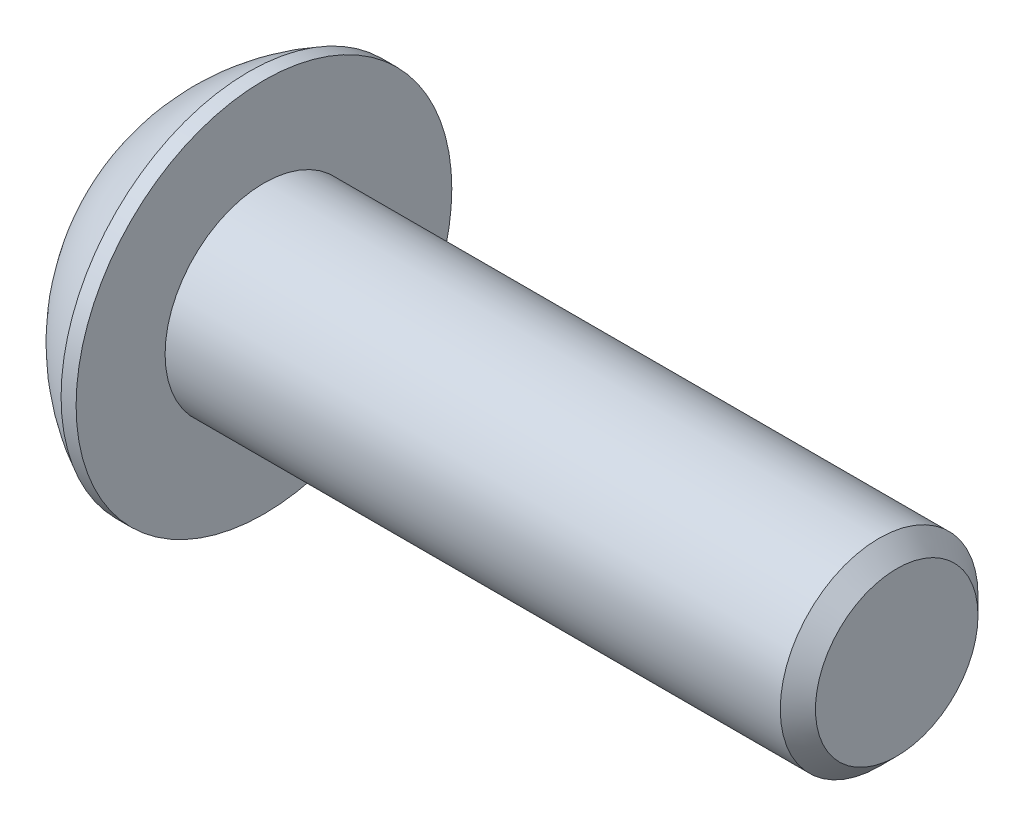
ISO-10303-21;
HEADER;
FILE_DESCRIPTION(('STEP AP214'),'2;1');
FILE_NAME('part.step','',(''),(''),'','','');
FILE_SCHEMA(('AUTOMOTIVE_DESIGN { 1 0 10303 214 1 1 1 1 }'));
ENDSEC;
DATA;
#1=APPLICATION_CONTEXT('core data for automotive mechanical design processes');
#2=APPLICATION_PROTOCOL_DEFINITION('international standard','automotive_design',2000,#1);
#3=PRODUCT_CONTEXT('',#1,'mechanical');
#4=PRODUCT('Part','Part','',(#3));
#5=PRODUCT_RELATED_PRODUCT_CATEGORY('part','',(#4));
#6=PRODUCT_DEFINITION_FORMATION('','',#4);
#7=PRODUCT_DEFINITION_CONTEXT('part definition',#1,'design');
#8=PRODUCT_DEFINITION('design','',#6,#7);
#9=PRODUCT_DEFINITION_SHAPE('','',#8);
#10=(LENGTH_UNIT() NAMED_UNIT(*) SI_UNIT(.MILLI.,.METRE.));
#11=(NAMED_UNIT(*) PLANE_ANGLE_UNIT() SI_UNIT($,.RADIAN.));
#12=(NAMED_UNIT(*) SI_UNIT($,.STERADIAN.) SOLID_ANGLE_UNIT());
#13=UNCERTAINTY_MEASURE_WITH_UNIT(LENGTH_MEASURE(1.E-05),#10,'distance_accuracy_value','');
#14=(GEOMETRIC_REPRESENTATION_CONTEXT(3) GLOBAL_UNCERTAINTY_ASSIGNED_CONTEXT((#13)) GLOBAL_UNIT_ASSIGNED_CONTEXT((#10,
#11,#12)) REPRESENTATION_CONTEXT('',''));
#15=CARTESIAN_POINT('',(0.,0.,0.));
#16=DIRECTION('',(0.,0.,1.));
#17=DIRECTION('',(1.,0.,0.));
#18=AXIS2_PLACEMENT_3D('',#15,#16,#17);
#19=CARTESIAN_POINT('',(-574.924243785843,0.,0.));
#20=DIRECTION('',(-1.,0.,0.));
#21=DIRECTION('',(0.,0.,1.));
#22=AXIS2_PLACEMENT_3D('',#19,#20,#21);
#23=CONICAL_SURFACE('',#22,1000.,1.0471975511966);
#24=DIRECTION('',(-0.5,0.,-0.86602540378444));
#25=VECTOR('',#24,1.);
#26=CARTESIAN_POINT('',(-574.924243785843,-1.22464679914735E-13,-1000.));
#27=LINE('',#26,#25);
#28=CARTESIAN_POINT('',(2.42602540378445,0.,0.));
#29=VERTEX_POINT('',#28);
#30=CARTESIAN_POINT('',(1.56,0.,-1.5));
#31=VERTEX_POINT('',#30);
#32=EDGE_CURVE('E11',#29,#31,#27,.T.);
#33=ORIENTED_EDGE('',*,*,#32,.T.);
#34=CARTESIAN_POINT('',(1.56,0.,0.));
#35=DIRECTION('',(-1.,0.,0.));
#36=DIRECTION('',(0.,0.,1.));
#37=AXIS2_PLACEMENT_3D('',#34,#35,#36);
#38=CIRCLE('',#37,1.5);
#39=CARTESIAN_POINT('',(1.56,-1.29903810567666,-0.75));
#40=VERTEX_POINT('',#39);
#41=EDGE_CURVE('E21',#31,#40,#38,.T.);
#42=ORIENTED_EDGE('',*,*,#41,.T.);
#43=CARTESIAN_POINT('',(1.56,0.,0.));
#44=DIRECTION('',(-1.,0.,0.));
#45=DIRECTION('',(0.,0.,1.));
#46=AXIS2_PLACEMENT_3D('',#43,#44,#45);
#47=CIRCLE('',#46,1.5);
#48=CARTESIAN_POINT('',(1.56,-1.29903810567666,0.75));
#49=VERTEX_POINT('',#48);
#50=EDGE_CURVE('E230',#40,#49,#47,.T.);
#51=ORIENTED_EDGE('',*,*,#50,.T.);
#52=CARTESIAN_POINT('',(1.56,0.,0.));
#53=DIRECTION('',(-1.,0.,0.));
#54=DIRECTION('',(0.,0.,1.));
#55=AXIS2_PLACEMENT_3D('',#52,#53,#54);
#56=CIRCLE('',#55,1.5);
#57=CARTESIAN_POINT('',(1.56,0.,1.5));
#58=VERTEX_POINT('',#57);
#59=EDGE_CURVE('E227',#49,#58,#56,.T.);
#60=ORIENTED_EDGE('',*,*,#59,.T.);
#61=CARTESIAN_POINT('',(1.56,0.,0.));
#62=DIRECTION('',(-1.,0.,0.));
#63=DIRECTION('',(0.,0.,1.));
#64=AXIS2_PLACEMENT_3D('',#61,#62,#63);
#65=CIRCLE('',#64,1.5);
#66=CARTESIAN_POINT('',(1.56,1.29903810567666,0.75));
#67=VERTEX_POINT('',#66);
#68=EDGE_CURVE('E135',#58,#67,#65,.T.);
#69=ORIENTED_EDGE('',*,*,#68,.T.);
#70=CARTESIAN_POINT('',(1.56,0.,0.));
#71=DIRECTION('',(-1.,0.,0.));
#72=DIRECTION('',(0.,0.,1.));
#73=AXIS2_PLACEMENT_3D('',#70,#71,#72);
#74=CIRCLE('',#73,1.5);
#75=CARTESIAN_POINT('',(1.56,1.29903810567666,-0.75));
#76=VERTEX_POINT('',#75);
#77=EDGE_CURVE('E130',#67,#76,#74,.T.);
#78=ORIENTED_EDGE('',*,*,#77,.T.);
#79=CARTESIAN_POINT('',(1.56,0.,0.));
#80=DIRECTION('',(-1.,0.,0.));
#81=DIRECTION('',(0.,0.,1.));
#82=AXIS2_PLACEMENT_3D('',#79,#80,#81);
#83=CIRCLE('',#82,1.5);
#84=EDGE_CURVE('E132',#76,#31,#83,.T.);
#85=ORIENTED_EDGE('',*,*,#84,.T.);
#86=ORIENTED_EDGE('',*,*,#32,.F.);
#87=EDGE_LOOP('',(#33,#42,#51,#60,#69,#78,#85,#86));
#88=FACE_BOUND('',#87,.T.);
#89=ADVANCED_FACE('F17',(#88),#23,.F.);
#90=CARTESIAN_POINT('',(1.56,-1.73205080756888,0.));
#91=DIRECTION('',(1.,0.,0.));
#92=DIRECTION('',(0.,1.,0.));
#93=AXIS2_PLACEMENT_3D('',#90,#91,#92);
#94=PLANE('',#93);
#95=ORIENTED_EDGE('',*,*,#41,.F.);
#96=DIRECTION('',(0.,1.,0.));
#97=VECTOR('',#96,1.);
#98=CARTESIAN_POINT('',(1.56,-0.866025403784438,-1.5));
#99=LINE('',#98,#97);
#100=CARTESIAN_POINT('',(1.56,-0.866025403784438,-1.5));
#101=VERTEX_POINT('',#100);
#102=EDGE_CURVE('E209',#101,#31,#99,.T.);
#103=ORIENTED_EDGE('',*,*,#102,.F.);
#104=DIRECTION('',(0.,0.5,-0.866025403784438));
#105=VECTOR('',#104,1.);
#106=CARTESIAN_POINT('',(1.56,-1.29903810567666,-0.75));
#107=LINE('',#106,#105);
#108=EDGE_CURVE('E210',#40,#101,#107,.T.);
#109=ORIENTED_EDGE('',*,*,#108,.F.);
#110=EDGE_LOOP('',(#95,#103,#109));
#111=FACE_BOUND('',#110,.T.);
#112=ADVANCED_FACE('F422',(#111),#94,.F.);
#113=CARTESIAN_POINT('',(1.56,-1.73205080756888,0.));
#114=DIRECTION('',(1.,0.,0.));
#115=DIRECTION('',(0.,1.,0.));
#116=AXIS2_PLACEMENT_3D('',#113,#114,#115);
#117=PLANE('',#116);
#118=ORIENTED_EDGE('',*,*,#50,.F.);
#119=DIRECTION('',(0.,0.5,-0.866025403784439));
#120=VECTOR('',#119,1.);
#121=CARTESIAN_POINT('',(1.56,-1.73205080756888,0.));
#122=LINE('',#121,#120);
#123=CARTESIAN_POINT('',(1.56,-1.73205080756888,0.));
#124=VERTEX_POINT('',#123);
#125=EDGE_CURVE('E204',#124,#40,#122,.T.);
#126=ORIENTED_EDGE('',*,*,#125,.F.);
#127=DIRECTION('',(0.,-0.5,-0.866025403784439));
#128=VECTOR('',#127,1.);
#129=CARTESIAN_POINT('',(1.56,-1.29903810567666,0.75));
#130=LINE('',#129,#128);
#131=EDGE_CURVE('E234',#49,#124,#130,.T.);
#132=ORIENTED_EDGE('',*,*,#131,.F.);
#133=EDGE_LOOP('',(#118,#126,#132));
#134=FACE_BOUND('',#133,.T.);
#135=ADVANCED_FACE('F416',(#134),#117,.F.);
#136=CARTESIAN_POINT('',(1.56,-1.73205080756888,0.));
#137=DIRECTION('',(1.,0.,0.));
#138=DIRECTION('',(0.,1.,0.));
#139=AXIS2_PLACEMENT_3D('',#136,#137,#138);
#140=PLANE('',#139);
#141=ORIENTED_EDGE('',*,*,#59,.F.);
#142=DIRECTION('',(0.,-0.5,-0.866025403784438));
#143=VECTOR('',#142,1.);
#144=CARTESIAN_POINT('',(1.56,-0.866025403784441,1.5));
#145=LINE('',#144,#143);
#146=CARTESIAN_POINT('',(1.56,-0.866025403784438,1.5));
#147=VERTEX_POINT('',#146);
#148=EDGE_CURVE('E231',#147,#49,#145,.T.);
#149=ORIENTED_EDGE('',*,*,#148,.F.);
#150=DIRECTION('',(0.,-1.,0.));
#151=VECTOR('',#150,1.);
#152=CARTESIAN_POINT('',(1.56,0.,1.5));
#153=LINE('',#152,#151);
#154=EDGE_CURVE('E150',#58,#147,#153,.T.);
#155=ORIENTED_EDGE('',*,*,#154,.F.);
#156=EDGE_LOOP('',(#141,#149,#155));
#157=FACE_BOUND('',#156,.T.);
#158=ADVANCED_FACE('F421',(#157),#140,.F.);
#159=CARTESIAN_POINT('',(1.56,-1.73205080756888,0.));
#160=DIRECTION('',(1.,0.,0.));
#161=DIRECTION('',(0.,1.,0.));
#162=AXIS2_PLACEMENT_3D('',#159,#160,#161);
#163=PLANE('',#162);
#164=ORIENTED_EDGE('',*,*,#68,.F.);
#165=DIRECTION('',(0.,-1.,0.));
#166=VECTOR('',#165,1.);
#167=CARTESIAN_POINT('',(1.56,0.866025403784439,1.5));
#168=LINE('',#167,#166);
#169=CARTESIAN_POINT('',(1.56,0.866025403784439,1.5));
#170=VERTEX_POINT('',#169);
#171=EDGE_CURVE('E225',#170,#58,#168,.T.);
#172=ORIENTED_EDGE('',*,*,#171,.F.);
#173=DIRECTION('',(0.,-0.5,0.866025403784439));
#174=VECTOR('',#173,1.);
#175=CARTESIAN_POINT('',(1.56,1.29903810567666,0.75));
#176=LINE('',#175,#174);
#177=EDGE_CURVE('E226',#67,#170,#176,.T.);
#178=ORIENTED_EDGE('',*,*,#177,.F.);
#179=EDGE_LOOP('',(#164,#172,#178));
#180=FACE_BOUND('',#179,.T.);
#181=ADVANCED_FACE('F273',(#180),#163,.F.);
#182=CARTESIAN_POINT('',(1.56,-1.73205080756888,0.));
#183=DIRECTION('',(1.,0.,0.));
#184=DIRECTION('',(0.,1.,0.));
#185=AXIS2_PLACEMENT_3D('',#182,#183,#184);
#186=PLANE('',#185);
#187=ORIENTED_EDGE('',*,*,#77,.F.);
#188=DIRECTION('',(0.,-0.5,0.866025403784439));
#189=VECTOR('',#188,1.);
#190=CARTESIAN_POINT('',(1.56,1.73205080756888,0.));
#191=LINE('',#190,#189);
#192=CARTESIAN_POINT('',(1.56,1.73205080756888,0.));
#193=VERTEX_POINT('',#192);
#194=EDGE_CURVE('E156',#193,#67,#191,.T.);
#195=ORIENTED_EDGE('',*,*,#194,.F.);
#196=DIRECTION('',(0.,0.5,0.866025403784439));
#197=VECTOR('',#196,1.);
#198=CARTESIAN_POINT('',(1.56,1.29903810567666,-0.75));
#199=LINE('',#198,#197);
#200=EDGE_CURVE('E153',#76,#193,#199,.T.);
#201=ORIENTED_EDGE('',*,*,#200,.F.);
#202=EDGE_LOOP('',(#187,#195,#201));
#203=FACE_BOUND('',#202,.T.);
#204=ADVANCED_FACE('F154',(#203),#186,.F.);
#205=CARTESIAN_POINT('',(1.56,-1.73205080756888,0.));
#206=DIRECTION('',(1.,0.,0.));
#207=DIRECTION('',(0.,1.,0.));
#208=AXIS2_PLACEMENT_3D('',#205,#206,#207);
#209=PLANE('',#208);
#210=ORIENTED_EDGE('',*,*,#84,.F.);
#211=DIRECTION('',(0.,0.5,0.866025403784439));
#212=VECTOR('',#211,1.);
#213=CARTESIAN_POINT('',(1.56,0.866025403784441,-1.5));
#214=LINE('',#213,#212);
#215=CARTESIAN_POINT('',(1.56,0.866025403784439,-1.5));
#216=VERTEX_POINT('',#215);
#217=EDGE_CURVE('E144',#216,#76,#214,.T.);
#218=ORIENTED_EDGE('',*,*,#217,.F.);
#219=DIRECTION('',(0.,1.,0.));
#220=VECTOR('',#219,1.);
#221=CARTESIAN_POINT('',(1.56,0.,-1.5));
#222=LINE('',#221,#220);
#223=EDGE_CURVE('E147',#31,#216,#222,.T.);
#224=ORIENTED_EDGE('',*,*,#223,.F.);
#225=EDGE_LOOP('',(#210,#218,#224));
#226=FACE_BOUND('',#225,.T.);
#227=ADVANCED_FACE('F142',(#226),#209,.F.);
#228=CARTESIAN_POINT('',(1.56,-0.866025403784438,1.5));
#229=DIRECTION('',(0.,0.,-1.));
#230=DIRECTION('',(0.,-1.,0.));
#231=AXIS2_PLACEMENT_3D('',#228,#229,#230);
#232=PLANE('',#231);
#233=ORIENTED_EDGE('',*,*,#171,.T.);
#234=ORIENTED_EDGE('',*,*,#154,.T.);
#235=DIRECTION('',(-1.,0.,0.));
#236=VECTOR('',#235,1.);
#237=CARTESIAN_POINT('',(1.56,-0.866025403784438,1.5));
#238=LINE('',#237,#236);
#239=CARTESIAN_POINT('',(0.,-0.866025403784438,1.5));
#240=VERTEX_POINT('',#239);
#241=EDGE_CURVE('E201',#147,#240,#238,.T.);
#242=ORIENTED_EDGE('',*,*,#241,.T.);
#243=DIRECTION('',(0.,-1.,0.));
#244=VECTOR('',#243,1.);
#245=CARTESIAN_POINT('',(0.,0.866025403784439,1.5));
#246=LINE('',#245,#244);
#247=CARTESIAN_POINT('',(0.,0.866025403784439,1.5));
#248=VERTEX_POINT('',#247);
#249=EDGE_CURVE('E199',#248,#240,#246,.T.);
#250=ORIENTED_EDGE('',*,*,#249,.F.);
#251=DIRECTION('',(-1.,0.,0.));
#252=VECTOR('',#251,1.);
#253=CARTESIAN_POINT('',(1.56,0.866025403784439,1.5));
#254=LINE('',#253,#252);
#255=EDGE_CURVE('E222',#170,#248,#254,.T.);
#256=ORIENTED_EDGE('',*,*,#255,.F.);
#257=EDGE_LOOP('',(#233,#234,#242,#250,#256));
#258=FACE_BOUND('',#257,.T.);
#259=ADVANCED_FACE('F280',(#258),#232,.T.);
#260=CARTESIAN_POINT('',(1.56,0.866025403784439,1.5));
#261=DIRECTION('',(0.,-0.866025403784439,-0.5));
#262=DIRECTION('',(0.,0.5,-0.866025403784439));
#263=AXIS2_PLACEMENT_3D('',#260,#261,#262);
#264=PLANE('',#263);
#265=ORIENTED_EDGE('',*,*,#194,.T.);
#266=ORIENTED_EDGE('',*,*,#177,.T.);
#267=ORIENTED_EDGE('',*,*,#255,.T.);
#268=DIRECTION('',(0.,-0.5,0.866025403784439));
#269=VECTOR('',#268,1.);
#270=CARTESIAN_POINT('',(0.,1.73205080756888,0.));
#271=LINE('',#270,#269);
#272=CARTESIAN_POINT('',(0.,1.73205080756888,0.));
#273=VERTEX_POINT('',#272);
#274=EDGE_CURVE('E189',#273,#248,#271,.T.);
#275=ORIENTED_EDGE('',*,*,#274,.F.);
#276=DIRECTION('',(-1.,0.,0.));
#277=VECTOR('',#276,1.);
#278=CARTESIAN_POINT('',(1.56,1.73205080756888,0.));
#279=LINE('',#278,#277);
#280=EDGE_CURVE('E160',#193,#273,#279,.T.);
#281=ORIENTED_EDGE('',*,*,#280,.F.);
#282=EDGE_LOOP('',(#265,#266,#267,#275,#281));
#283=FACE_BOUND('',#282,.T.);
#284=ADVANCED_FACE('F269',(#283),#264,.T.);
#285=CARTESIAN_POINT('',(1.56,1.73205080756888,0.));
#286=DIRECTION('',(0.,-0.866025403784439,0.5));
#287=DIRECTION('',(-1.,0.,0.));
#288=AXIS2_PLACEMENT_3D('',#285,#286,#287);
#289=PLANE('',#288);
#290=ORIENTED_EDGE('',*,*,#217,.T.);
#291=ORIENTED_EDGE('',*,*,#200,.T.);
#292=ORIENTED_EDGE('',*,*,#280,.T.);
#293=DIRECTION('',(0.,0.5,0.866025403784439));
#294=VECTOR('',#293,1.);
#295=CARTESIAN_POINT('',(0.,0.866025403784441,-1.5));
#296=LINE('',#295,#294);
#297=CARTESIAN_POINT('',(0.,0.866025403784439,-1.5));
#298=VERTEX_POINT('',#297);
#299=EDGE_CURVE('E182',#298,#273,#296,.T.);
#300=ORIENTED_EDGE('',*,*,#299,.F.);
#301=DIRECTION('',(-1.,0.,0.));
#302=VECTOR('',#301,1.);
#303=CARTESIAN_POINT('',(1.56,0.866025403784439,-1.5));
#304=LINE('',#303,#302);
#305=EDGE_CURVE('E164',#216,#298,#304,.T.);
#306=ORIENTED_EDGE('',*,*,#305,.F.);
#307=EDGE_LOOP('',(#290,#291,#292,#300,#306));
#308=FACE_BOUND('',#307,.T.);
#309=ADVANCED_FACE('F162',(#308),#289,.T.);
#310=CARTESIAN_POINT('',(1.56,0.866025403784439,-1.5));
#311=DIRECTION('',(0.,0.,1.));
#312=DIRECTION('',(1.,0.,0.));
#313=AXIS2_PLACEMENT_3D('',#310,#311,#312);
#314=PLANE('',#313);
#315=ORIENTED_EDGE('',*,*,#102,.T.);
#316=ORIENTED_EDGE('',*,*,#223,.T.);
#317=ORIENTED_EDGE('',*,*,#305,.T.);
#318=DIRECTION('',(0.,1.,0.));
#319=VECTOR('',#318,1.);
#320=CARTESIAN_POINT('',(0.,-0.866025403784438,-1.5));
#321=LINE('',#320,#319);
#322=CARTESIAN_POINT('',(0.,-0.866025403784438,-1.5));
#323=VERTEX_POINT('',#322);
#324=EDGE_CURVE('E178',#323,#298,#321,.T.);
#325=ORIENTED_EDGE('',*,*,#324,.F.);
#326=DIRECTION('',(-1.,0.,0.));
#327=VECTOR('',#326,1.);
#328=CARTESIAN_POINT('',(1.56,-0.866025403784438,-1.5));
#329=LINE('',#328,#327);
#330=EDGE_CURVE('E206',#101,#323,#329,.T.);
#331=ORIENTED_EDGE('',*,*,#330,.F.);
#332=EDGE_LOOP('',(#315,#316,#317,#325,#331));
#333=FACE_BOUND('',#332,.T.);
#334=ADVANCED_FACE('F401',(#333),#314,.T.);
#335=CARTESIAN_POINT('',(1.56,-0.866025403784438,-1.5));
#336=DIRECTION('',(0.,0.866025403784439,0.5));
#337=DIRECTION('',(1.,0.,0.));
#338=AXIS2_PLACEMENT_3D('',#335,#336,#337);
#339=PLANE('',#338);
#340=ORIENTED_EDGE('',*,*,#125,.T.);
#341=ORIENTED_EDGE('',*,*,#108,.T.);
#342=ORIENTED_EDGE('',*,*,#330,.T.);
#343=DIRECTION('',(0.,0.5,-0.866025403784439));
#344=VECTOR('',#343,1.);
#345=CARTESIAN_POINT('',(0.,-1.73205080756888,0.));
#346=LINE('',#345,#344);
#347=CARTESIAN_POINT('',(0.,-1.73205080756888,0.));
#348=VERTEX_POINT('',#347);
#349=EDGE_CURVE('E175',#348,#323,#346,.T.);
#350=ORIENTED_EDGE('',*,*,#349,.F.);
#351=DIRECTION('',(-1.,0.,0.));
#352=VECTOR('',#351,1.);
#353=CARTESIAN_POINT('',(1.56,-1.73205080756888,0.));
#354=LINE('',#353,#352);
#355=EDGE_CURVE('E205',#124,#348,#354,.T.);
#356=ORIENTED_EDGE('',*,*,#355,.F.);
#357=EDGE_LOOP('',(#340,#341,#342,#350,#356));
#358=FACE_BOUND('',#357,.T.);
#359=ADVANCED_FACE('F391',(#358),#339,.T.);
#360=CARTESIAN_POINT('',(1.56,-1.73205080756888,0.));
#361=DIRECTION('',(0.,0.866025403784439,-0.5));
#362=DIRECTION('',(-1.,0.,0.));
#363=AXIS2_PLACEMENT_3D('',#360,#361,#362);
#364=PLANE('',#363);
#365=ORIENTED_EDGE('',*,*,#148,.T.);
#366=ORIENTED_EDGE('',*,*,#131,.T.);
#367=ORIENTED_EDGE('',*,*,#355,.T.);
#368=DIRECTION('',(0.,-0.5,-0.866025403784439));
#369=VECTOR('',#368,1.);
#370=CARTESIAN_POINT('',(0.,-0.866025403784441,1.5));
#371=LINE('',#370,#369);
#372=EDGE_CURVE('E179',#240,#348,#371,.T.);
#373=ORIENTED_EDGE('',*,*,#372,.F.);
#374=ORIENTED_EDGE('',*,*,#241,.F.);
#375=EDGE_LOOP('',(#365,#366,#367,#373,#374));
#376=FACE_BOUND('',#375,.T.);
#377=ADVANCED_FACE('F385',(#376),#364,.T.);
#378=CARTESIAN_POINT('',(18.75,0.,0.));
#379=DIRECTION('',(-1.,0.,0.));
#380=DIRECTION('',(0.,0.,1.));
#381=AXIS2_PLACEMENT_3D('',#378,#379,#380);
#382=PLANE('',#381);
#383=CARTESIAN_POINT('',(18.75,0.,0.));
#384=DIRECTION('',(-1.,0.,0.));
#385=DIRECTION('',(0.,0.,1.));
#386=AXIS2_PLACEMENT_3D('',#383,#384,#385);
#387=CIRCLE('',#386,2.055);
#388=CARTESIAN_POINT('',(18.75,0.,-2.055));
#389=VERTEX_POINT('',#388);
#390=EDGE_CURVE('E235',#389,#389,#387,.T.);
#391=ORIENTED_EDGE('',*,*,#390,.F.);
#392=EDGE_LOOP('',(#391));
#393=FACE_BOUND('',#392,.T.);
#394=ADVANCED_FACE('F390',(#393),#382,.F.);
#395=CARTESIAN_POINT('',(18.75,0.,0.));
#396=DIRECTION('',(-1.,0.,0.));
#397=DIRECTION('',(0.,0.,1.));
#398=AXIS2_PLACEMENT_3D('',#395,#396,#397);
#399=CONICAL_SURFACE('',#398,2.055,0.785398163397441);
#400=CARTESIAN_POINT('',(18.305,0.,0.));
#401=DIRECTION('',(-1.,0.,0.));
#402=DIRECTION('',(0.,0.,1.));
#403=AXIS2_PLACEMENT_3D('',#400,#401,#402);
#404=CIRCLE('',#403,2.5);
#405=CARTESIAN_POINT('',(18.305,0.,-2.5));
#406=VERTEX_POINT('',#405);
#407=EDGE_CURVE('E211',#406,#406,#404,.T.);
#408=ORIENTED_EDGE('',*,*,#407,.F.);
#409=DIRECTION('',(0.707106781186553,0.,0.707106781186542));
#410=VECTOR('',#409,1.);
#411=CARTESIAN_POINT('',(18.75,0.,-2.055));
#412=LINE('',#411,#410);
#413=EDGE_CURVE('E240',#406,#389,#412,.T.);
#414=ORIENTED_EDGE('',*,*,#413,.T.);
#415=ORIENTED_EDGE('',*,*,#390,.T.);
#416=ORIENTED_EDGE('',*,*,#413,.F.);
#417=EDGE_LOOP('',(#408,#414,#415,#416));
#418=FACE_BOUND('',#417,.T.);
#419=ADVANCED_FACE('F410',(#418),#399,.T.);
#420=CARTESIAN_POINT('',(2.75,2.5,0.));
#421=DIRECTION('',(-1.,0.,0.));
#422=DIRECTION('',(0.,0.,1.));
#423=AXIS2_PLACEMENT_3D('',#420,#421,#422);
#424=PLANE('',#423);
#425=CARTESIAN_POINT('',(2.75,0.,0.));
#426=DIRECTION('',(-1.,0.,0.));
#427=DIRECTION('',(0.,0.,1.));
#428=AXIS2_PLACEMENT_3D('',#425,#426,#427);
#429=CIRCLE('',#428,2.5);
#430=CARTESIAN_POINT('',(2.75,0.,-2.5));
#431=VERTEX_POINT('',#430);
#432=EDGE_CURVE('E307',#431,#431,#429,.T.);
#433=ORIENTED_EDGE('',*,*,#432,.T.);
#434=EDGE_LOOP('',(#433));
#435=FACE_BOUND('',#434,.T.);
#436=CARTESIAN_POINT('',(2.75,0.,0.));
#437=DIRECTION('',(-1.,0.,0.));
#438=DIRECTION('',(0.,0.,1.));
#439=AXIS2_PLACEMENT_3D('',#436,#437,#438);
#440=CIRCLE('',#439,4.75);
#441=CARTESIAN_POINT('',(2.75,0.,-4.75));
#442=VERTEX_POINT('',#441);
#443=EDGE_CURVE('E221',#442,#442,#440,.T.);
#444=ORIENTED_EDGE('',*,*,#443,.F.);
#445=EDGE_LOOP('',(#444));
#446=FACE_BOUND('',#445,.T.);
#447=ADVANCED_FACE('F495',(#435,#446),#424,.F.);
#448=CARTESIAN_POINT('',(0.,0.,0.));
#449=DIRECTION('',(-1.,0.,0.));
#450=DIRECTION('',(0.,0.,1.));
#451=AXIS2_PLACEMENT_3D('',#448,#449,#450);
#452=CYLINDRICAL_SURFACE('',#451,4.75);
#453=CARTESIAN_POINT('',(2.37,0.,0.));
#454=DIRECTION('',(-1.,0.,0.));
#455=DIRECTION('',(0.,0.,1.));
#456=AXIS2_PLACEMENT_3D('',#453,#454,#455);
#457=CIRCLE('',#456,4.75);
#458=CARTESIAN_POINT('',(2.37,0.,-4.75));
#459=VERTEX_POINT('',#458);
#460=EDGE_CURVE('E195',#459,#459,#457,.T.);
#461=ORIENTED_EDGE('',*,*,#460,.F.);
#462=DIRECTION('',(1.,0.,0.));
#463=VECTOR('',#462,1.);
#464=CARTESIAN_POINT('',(0.,0.,-4.75));
#465=LINE('',#464,#463);
#466=EDGE_CURVE('E217',#459,#442,#465,.T.);
#467=ORIENTED_EDGE('',*,*,#466,.T.);
#468=ORIENTED_EDGE('',*,*,#443,.T.);
#469=ORIENTED_EDGE('',*,*,#466,.F.);
#470=EDGE_LOOP('',(#461,#467,#468,#469));
#471=FACE_BOUND('',#470,.T.);
#472=ADVANCED_FACE('F19',(#471),#452,.T.);
#473=CARTESIAN_POINT('',(4.75501582278481,0.,0.));
#474=DIRECTION('',(0.,0.,1.));
#475=DIRECTION('',(-0.999995616798622,0.00296080792091682,0.));
#476=AXIS2_PLACEMENT_3D('',#473,#474,#475);
#477=SPHERICAL_SURFACE('',#476,5.3151482081814);
#478=CARTESIAN_POINT('',(4.75501582278481,0.,0.));
#479=DIRECTION('',(-1.,0.,0.));
#480=DIRECTION('',(0.,0.,1.));
#481=AXIS2_PLACEMENT_3D('',#478,#479,#480);
#482=SPHERICAL_SURFACE('',#481,5.3151482081814);
#483=CARTESIAN_POINT('',(0.,0.,0.));
#484=DIRECTION('',(-1.,0.,0.));
#485=DIRECTION('',(0.,0.,1.));
#486=AXIS2_PLACEMENT_3D('',#483,#484,#485);
#487=CIRCLE('',#486,2.375);
#488=CARTESIAN_POINT('',(0.,0.,2.375));
#489=VERTEX_POINT('',#488);
#490=EDGE_CURVE('E215',#489,#489,#487,.T.);
#491=ORIENTED_EDGE('',*,*,#490,.F.);
#492=EDGE_LOOP('',(#491));
#493=FACE_BOUND('',#492,.T.);
#494=ORIENTED_EDGE('',*,*,#460,.T.);
#495=EDGE_LOOP('',(#494));
#496=FACE_BOUND('',#495,.T.);
#497=ADVANCED_FACE('F460',(#493,#496),#482,.T.);
#498=CARTESIAN_POINT('',(0.,0.,0.));
#499=DIRECTION('',(-1.,0.,0.));
#500=DIRECTION('',(0.,0.,1.));
#501=AXIS2_PLACEMENT_3D('',#498,#499,#500);
#502=PLANE('',#501);
#503=ORIENTED_EDGE('',*,*,#249,.T.);
#504=ORIENTED_EDGE('',*,*,#372,.T.);
#505=ORIENTED_EDGE('',*,*,#349,.T.);
#506=ORIENTED_EDGE('',*,*,#324,.T.);
#507=ORIENTED_EDGE('',*,*,#299,.T.);
#508=ORIENTED_EDGE('',*,*,#274,.T.);
#509=EDGE_LOOP('',(#503,#504,#505,#506,#507,#508));
#510=FACE_BOUND('',#509,.T.);
#511=ORIENTED_EDGE('',*,*,#490,.T.);
#512=EDGE_LOOP('',(#511));
#513=FACE_BOUND('',#512,.T.);
#514=ADVANCED_FACE('F465',(#510,#513),#502,.T.);
#515=CARTESIAN_POINT('',(0.,0.,0.));
#516=DIRECTION('',(-1.,0.,0.));
#517=DIRECTION('',(0.,0.,1.));
#518=AXIS2_PLACEMENT_3D('',#515,#516,#517);
#519=CYLINDRICAL_SURFACE('',#518,2.5);
#520=ORIENTED_EDGE('',*,*,#432,.F.);
#521=DIRECTION('',(1.,0.,0.));
#522=VECTOR('',#521,1.);
#523=CARTESIAN_POINT('',(0.,0.,-2.5));
#524=LINE('',#523,#522);
#525=EDGE_CURVE('E216',#431,#406,#524,.T.);
#526=ORIENTED_EDGE('',*,*,#525,.T.);
#527=ORIENTED_EDGE('',*,*,#407,.T.);
#528=ORIENTED_EDGE('',*,*,#525,.F.);
#529=EDGE_LOOP('',(#520,#526,#527,#528));
#530=FACE_BOUND('',#529,.T.);
#531=ADVANCED_FACE('F490',(#530),#519,.T.);
#532=CLOSED_SHELL('',(#89,#112,#135,#158,#181,#204,#227,#259,#284,#309,#334,#359,#377,#394,#419,
#447,#472,#497,#514,#531));
#533=MANIFOLD_SOLID_BREP('B1',#532);
#534=ADVANCED_BREP_SHAPE_REPRESENTATION('',(#18,#533),#14);
#535=SHAPE_DEFINITION_REPRESENTATION(#9,#534);
ENDSEC;
END-ISO-10303-21;
